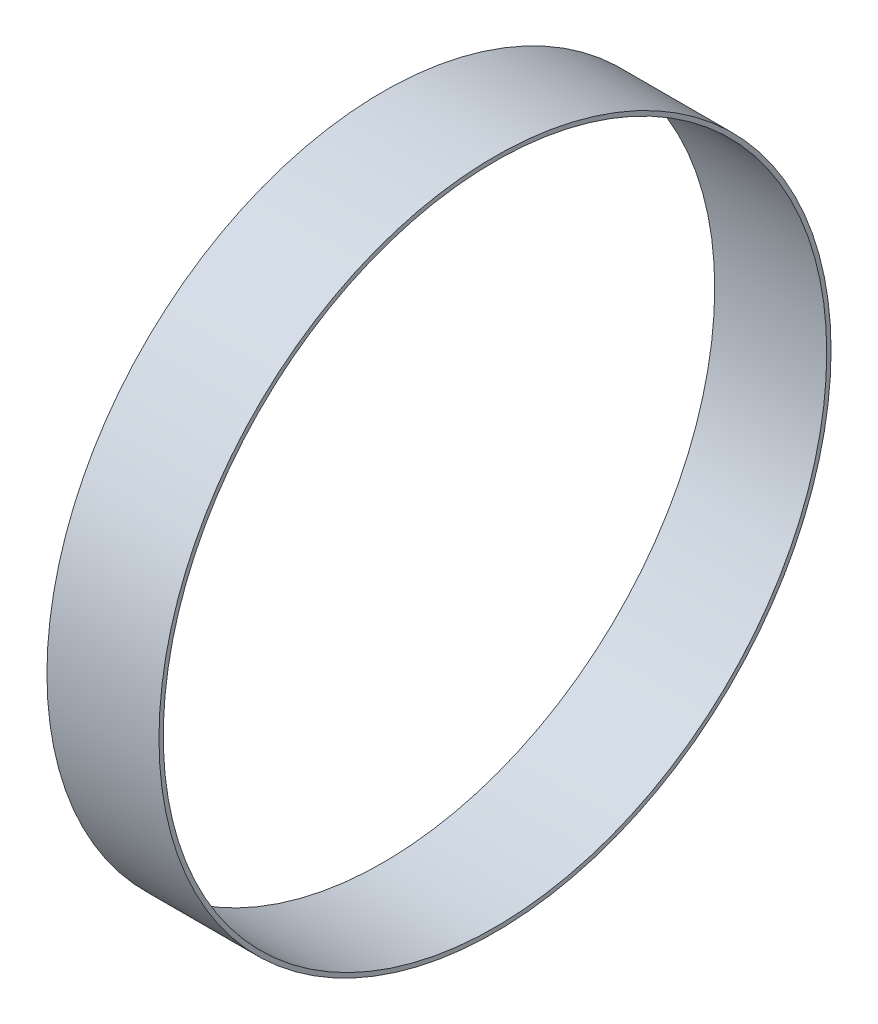
ISO-10303-21;
HEADER;
FILE_DESCRIPTION(('STEP AP214'),'2;1');
FILE_NAME('part.step','',(''),(''),'','','');
FILE_SCHEMA(('AUTOMOTIVE_DESIGN { 1 0 10303 214 1 1 1 1 }'));
ENDSEC;
DATA;
#1=APPLICATION_CONTEXT('core data for automotive mechanical design processes');
#2=APPLICATION_PROTOCOL_DEFINITION('international standard','automotive_design',2000,#1);
#3=PRODUCT_CONTEXT('',#1,'mechanical');
#4=PRODUCT('Part','Part','',(#3));
#5=PRODUCT_RELATED_PRODUCT_CATEGORY('part','',(#4));
#6=PRODUCT_DEFINITION_FORMATION('','',#4);
#7=PRODUCT_DEFINITION_CONTEXT('part definition',#1,'design');
#8=PRODUCT_DEFINITION('design','',#6,#7);
#9=PRODUCT_DEFINITION_SHAPE('','',#8);
#10=(LENGTH_UNIT() NAMED_UNIT(*) SI_UNIT(.MILLI.,.METRE.));
#11=(NAMED_UNIT(*) PLANE_ANGLE_UNIT() SI_UNIT($,.RADIAN.));
#12=(NAMED_UNIT(*) SI_UNIT($,.STERADIAN.) SOLID_ANGLE_UNIT());
#13=UNCERTAINTY_MEASURE_WITH_UNIT(LENGTH_MEASURE(1.E-05),#10,'distance_accuracy_value','');
#14=(GEOMETRIC_REPRESENTATION_CONTEXT(3) GLOBAL_UNCERTAINTY_ASSIGNED_CONTEXT((#13)) GLOBAL_UNIT_ASSIGNED_CONTEXT((#10,
#11,#12)) REPRESENTATION_CONTEXT('',''));
#15=CARTESIAN_POINT('',(0.,0.,0.));
#16=DIRECTION('',(0.,0.,1.));
#17=DIRECTION('',(1.,0.,0.));
#18=AXIS2_PLACEMENT_3D('',#15,#16,#17);
#19=CARTESIAN_POINT('',(25.4,0.,0.));
#20=DIRECTION('',(-1.,0.,0.));
#21=DIRECTION('',(0.,0.,1.));
#22=AXIS2_PLACEMENT_3D('',#19,#20,#21);
#23=CYLINDRICAL_SURFACE('',#22,76.2);
#24=CARTESIAN_POINT('',(25.4,0.,0.));
#25=DIRECTION('',(1.,0.,0.));
#26=DIRECTION('',(0.,0.,-1.));
#27=AXIS2_PLACEMENT_3D('',#24,#25,#26);
#28=CIRCLE('',#27,76.2);
#29=CARTESIAN_POINT('',(25.4,0.,-76.2));
#30=VERTEX_POINT('',#29);
#31=EDGE_CURVE('E10',#30,#30,#28,.T.);
#32=ORIENTED_EDGE('',*,*,#31,.F.);
#33=EDGE_LOOP('',(#32));
#34=FACE_BOUND('',#33,.T.);
#35=CARTESIAN_POINT('',(0.,0.,0.));
#36=DIRECTION('',(1.,0.,0.));
#37=DIRECTION('',(0.,0.,-1.));
#38=AXIS2_PLACEMENT_3D('',#35,#36,#37);
#39=CIRCLE('',#38,76.2);
#40=CARTESIAN_POINT('',(0.,0.,-76.2));
#41=VERTEX_POINT('',#40);
#42=EDGE_CURVE('E46',#41,#41,#39,.T.);
#43=ORIENTED_EDGE('',*,*,#42,.T.);
#44=EDGE_LOOP('',(#43));
#45=FACE_BOUND('',#44,.T.);
#46=ADVANCED_FACE('F43',(#34,#45),#23,.T.);
#47=CARTESIAN_POINT('',(25.4,0.,0.));
#48=DIRECTION('',(1.,0.,0.));
#49=DIRECTION('',(0.,0.,-1.));
#50=AXIS2_PLACEMENT_3D('',#47,#48,#49);
#51=PLANE('',#50);
#52=CARTESIAN_POINT('',(25.4,0.,0.));
#53=DIRECTION('',(1.,0.,0.));
#54=DIRECTION('',(0.,0.,-1.));
#55=AXIS2_PLACEMENT_3D('',#52,#53,#54);
#56=CIRCLE('',#55,75.2221);
#57=CARTESIAN_POINT('',(25.4,0.,-75.2221));
#58=VERTEX_POINT('',#57);
#59=EDGE_CURVE('E57',#58,#58,#56,.T.);
#60=ORIENTED_EDGE('',*,*,#59,.F.);
#61=EDGE_LOOP('',(#60));
#62=FACE_BOUND('',#61,.T.);
#63=ORIENTED_EDGE('',*,*,#31,.T.);
#64=EDGE_LOOP('',(#63));
#65=FACE_BOUND('',#64,.T.);
#66=ADVANCED_FACE('F74',(#62,#65),#51,.T.);
#67=CARTESIAN_POINT('',(0.,0.,0.));
#68=DIRECTION('',(1.,0.,0.));
#69=DIRECTION('',(0.,0.,-1.));
#70=AXIS2_PLACEMENT_3D('',#67,#68,#69);
#71=PLANE('',#70);
#72=CARTESIAN_POINT('',(0.,0.,0.));
#73=DIRECTION('',(1.,0.,0.));
#74=DIRECTION('',(0.,0.,-1.));
#75=AXIS2_PLACEMENT_3D('',#72,#73,#74);
#76=CIRCLE('',#75,75.2221);
#77=CARTESIAN_POINT('',(0.,0.,-75.2221));
#78=VERTEX_POINT('',#77);
#79=EDGE_CURVE('E55',#78,#78,#76,.T.);
#80=ORIENTED_EDGE('',*,*,#79,.T.);
#81=EDGE_LOOP('',(#80));
#82=FACE_BOUND('',#81,.T.);
#83=ORIENTED_EDGE('',*,*,#42,.F.);
#84=EDGE_LOOP('',(#83));
#85=FACE_BOUND('',#84,.T.);
#86=ADVANCED_FACE('F65',(#82,#85),#71,.F.);
#87=CARTESIAN_POINT('',(0.,0.,0.));
#88=DIRECTION('',(1.,0.,0.));
#89=DIRECTION('',(0.,0.,-1.));
#90=AXIS2_PLACEMENT_3D('',#87,#88,#89);
#91=CYLINDRICAL_SURFACE('',#90,75.2221);
#92=ORIENTED_EDGE('',*,*,#79,.F.);
#93=EDGE_LOOP('',(#92));
#94=FACE_BOUND('',#93,.T.);
#95=ORIENTED_EDGE('',*,*,#59,.T.);
#96=EDGE_LOOP('',(#95));
#97=FACE_BOUND('',#96,.T.);
#98=ADVANCED_FACE('F68',(#94,#97),#91,.F.);
#99=CLOSED_SHELL('',(#46,#66,#86,#98));
#100=MANIFOLD_SOLID_BREP('B2',#99);
#101=ADVANCED_BREP_SHAPE_REPRESENTATION('',(#18,#100),#14);
#102=SHAPE_DEFINITION_REPRESENTATION(#9,#101);
ENDSEC;
END-ISO-10303-21;
